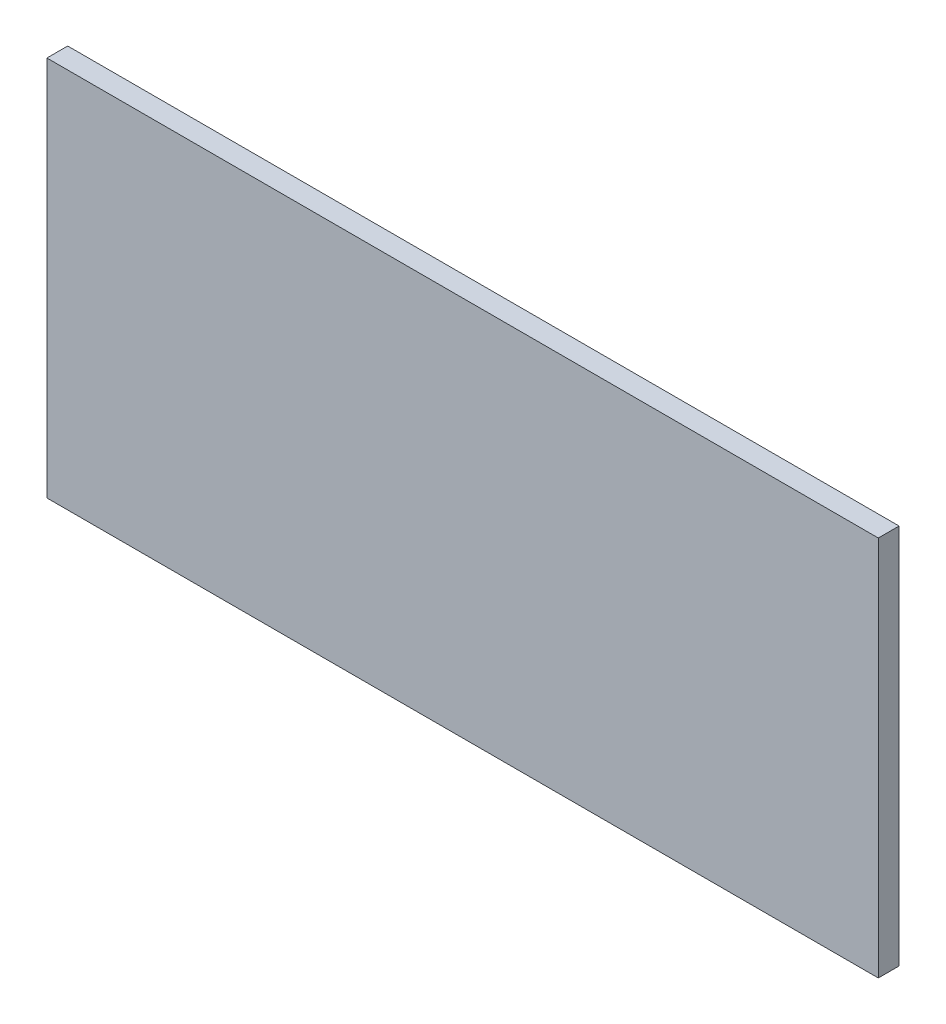
ISO-10303-21;
HEADER;
FILE_DESCRIPTION(('STEP AP214'),'2;1');
FILE_NAME('part.step','',(''),(''),'','','');
FILE_SCHEMA(('AUTOMOTIVE_DESIGN { 1 0 10303 214 1 1 1 1 }'));
ENDSEC;
DATA;
#1=APPLICATION_CONTEXT('core data for automotive mechanical design processes');
#2=APPLICATION_PROTOCOL_DEFINITION('international standard','automotive_design',2000,#1);
#3=PRODUCT_CONTEXT('',#1,'mechanical');
#4=PRODUCT('Part','Part','',(#3));
#5=PRODUCT_RELATED_PRODUCT_CATEGORY('part','',(#4));
#6=PRODUCT_DEFINITION_FORMATION('','',#4);
#7=PRODUCT_DEFINITION_CONTEXT('part definition',#1,'design');
#8=PRODUCT_DEFINITION('design','',#6,#7);
#9=PRODUCT_DEFINITION_SHAPE('','',#8);
#10=(LENGTH_UNIT() NAMED_UNIT(*) SI_UNIT(.MILLI.,.METRE.));
#11=(NAMED_UNIT(*) PLANE_ANGLE_UNIT() SI_UNIT($,.RADIAN.));
#12=(NAMED_UNIT(*) SI_UNIT($,.STERADIAN.) SOLID_ANGLE_UNIT());
#13=UNCERTAINTY_MEASURE_WITH_UNIT(LENGTH_MEASURE(1.E-05),#10,'distance_accuracy_value','');
#14=(GEOMETRIC_REPRESENTATION_CONTEXT(3) GLOBAL_UNCERTAINTY_ASSIGNED_CONTEXT((#13)) GLOBAL_UNIT_ASSIGNED_CONTEXT((#10,
#11,#12)) REPRESENTATION_CONTEXT('',''));
#15=CARTESIAN_POINT('',(0.,0.,0.));
#16=DIRECTION('',(0.,0.,1.));
#17=DIRECTION('',(1.,0.,0.));
#18=AXIS2_PLACEMENT_3D('',#15,#16,#17);
#19=CARTESIAN_POINT('',(0.,0.,-3.));
#20=DIRECTION('',(-1.,0.,0.));
#21=DIRECTION('',(0.,0.,1.));
#22=AXIS2_PLACEMENT_3D('',#19,#20,#21);
#23=PLANE('',#22);
#24=DIRECTION('',(0.,-1.,0.));
#25=VECTOR('',#24,1.);
#26=CARTESIAN_POINT('',(0.,0.,0.));
#27=LINE('',#26,#25);
#28=CARTESIAN_POINT('',(0.,55.,0.));
#29=VERTEX_POINT('',#28);
#30=CARTESIAN_POINT('',(0.,0.,0.));
#31=VERTEX_POINT('',#30);
#32=EDGE_CURVE('E97',#29,#31,#27,.T.);
#33=ORIENTED_EDGE('',*,*,#32,.F.);
#34=DIRECTION('',(0.,0.,1.));
#35=VECTOR('',#34,1.);
#36=CARTESIAN_POINT('',(0.,55.,-3.));
#37=LINE('',#36,#35);
#38=CARTESIAN_POINT('',(0.,55.,-3.));
#39=VERTEX_POINT('',#38);
#40=EDGE_CURVE('E11',#39,#29,#37,.T.);
#41=ORIENTED_EDGE('',*,*,#40,.F.);
#42=DIRECTION('',(0.,-1.,0.));
#43=VECTOR('',#42,1.);
#44=CARTESIAN_POINT('',(0.,0.,-3.));
#45=LINE('',#44,#43);
#46=CARTESIAN_POINT('',(0.,0.,-3.));
#47=VERTEX_POINT('',#46);
#48=EDGE_CURVE('E91',#39,#47,#45,.T.);
#49=ORIENTED_EDGE('',*,*,#48,.T.);
#50=DIRECTION('',(0.,0.,1.));
#51=VECTOR('',#50,1.);
#52=CARTESIAN_POINT('',(0.,0.,-3.));
#53=LINE('',#52,#51);
#54=EDGE_CURVE('E36',#47,#31,#53,.T.);
#55=ORIENTED_EDGE('',*,*,#54,.T.);
#56=EDGE_LOOP('',(#33,#41,#49,#55));
#57=FACE_BOUND('',#56,.T.);
#58=ADVANCED_FACE('F33',(#57),#23,.T.);
#59=CARTESIAN_POINT('',(0.,55.,-3.));
#60=DIRECTION('',(0.,1.,0.));
#61=DIRECTION('',(0.,0.,1.));
#62=AXIS2_PLACEMENT_3D('',#59,#60,#61);
#63=PLANE('',#62);
#64=DIRECTION('',(-1.,0.,0.));
#65=VECTOR('',#64,1.);
#66=CARTESIAN_POINT('',(0.,55.,0.));
#67=LINE('',#66,#65);
#68=CARTESIAN_POINT('',(120.,55.,0.));
#69=VERTEX_POINT('',#68);
#70=EDGE_CURVE('E93',#69,#29,#67,.T.);
#71=ORIENTED_EDGE('',*,*,#70,.F.);
#72=DIRECTION('',(0.,0.,1.));
#73=VECTOR('',#72,1.);
#74=CARTESIAN_POINT('',(120.,55.,-3.));
#75=LINE('',#74,#73);
#76=CARTESIAN_POINT('',(120.,55.,-3.));
#77=VERTEX_POINT('',#76);
#78=EDGE_CURVE('E42',#77,#69,#75,.T.);
#79=ORIENTED_EDGE('',*,*,#78,.F.);
#80=DIRECTION('',(-1.,0.,0.));
#81=VECTOR('',#80,1.);
#82=CARTESIAN_POINT('',(0.,55.,-3.));
#83=LINE('',#82,#81);
#84=EDGE_CURVE('E88',#77,#39,#83,.T.);
#85=ORIENTED_EDGE('',*,*,#84,.T.);
#86=ORIENTED_EDGE('',*,*,#40,.T.);
#87=EDGE_LOOP('',(#71,#79,#85,#86));
#88=FACE_BOUND('',#87,.T.);
#89=ADVANCED_FACE('F107',(#88),#63,.T.);
#90=CARTESIAN_POINT('',(120.,0.,-3.));
#91=DIRECTION('',(1.,0.,0.));
#92=DIRECTION('',(0.,0.,-1.));
#93=AXIS2_PLACEMENT_3D('',#90,#91,#92);
#94=PLANE('',#93);
#95=DIRECTION('',(0.,1.,0.));
#96=VECTOR('',#95,1.);
#97=CARTESIAN_POINT('',(120.,0.,0.));
#98=LINE('',#97,#96);
#99=CARTESIAN_POINT('',(120.,0.,0.));
#100=VERTEX_POINT('',#99);
#101=EDGE_CURVE('E83',#100,#69,#98,.T.);
#102=ORIENTED_EDGE('',*,*,#101,.F.);
#103=DIRECTION('',(0.,0.,1.));
#104=VECTOR('',#103,1.);
#105=CARTESIAN_POINT('',(120.,0.,-3.));
#106=LINE('',#105,#104);
#107=CARTESIAN_POINT('',(120.,0.,-3.));
#108=VERTEX_POINT('',#107);
#109=EDGE_CURVE('E78',#108,#100,#106,.T.);
#110=ORIENTED_EDGE('',*,*,#109,.F.);
#111=DIRECTION('',(0.,1.,0.));
#112=VECTOR('',#111,1.);
#113=CARTESIAN_POINT('',(120.,0.,-3.));
#114=LINE('',#113,#112);
#115=EDGE_CURVE('E81',#108,#77,#114,.T.);
#116=ORIENTED_EDGE('',*,*,#115,.T.);
#117=ORIENTED_EDGE('',*,*,#78,.T.);
#118=EDGE_LOOP('',(#102,#110,#116,#117));
#119=FACE_BOUND('',#118,.T.);
#120=ADVANCED_FACE('F80',(#119),#94,.T.);
#121=CARTESIAN_POINT('',(0.,0.,-3.));
#122=DIRECTION('',(0.,-1.,0.));
#123=DIRECTION('',(0.,0.,-1.));
#124=AXIS2_PLACEMENT_3D('',#121,#122,#123);
#125=PLANE('',#124);
#126=DIRECTION('',(1.,0.,0.));
#127=VECTOR('',#126,1.);
#128=CARTESIAN_POINT('',(0.,0.,0.));
#129=LINE('',#128,#127);
#130=EDGE_CURVE('E100',#31,#100,#129,.T.);
#131=ORIENTED_EDGE('',*,*,#130,.F.);
#132=ORIENTED_EDGE('',*,*,#54,.F.);
#133=DIRECTION('',(1.,0.,0.));
#134=VECTOR('',#133,1.);
#135=CARTESIAN_POINT('',(0.,0.,-3.));
#136=LINE('',#135,#134);
#137=EDGE_CURVE('E87',#47,#108,#136,.T.);
#138=ORIENTED_EDGE('',*,*,#137,.T.);
#139=ORIENTED_EDGE('',*,*,#109,.T.);
#140=EDGE_LOOP('',(#131,#132,#138,#139));
#141=FACE_BOUND('',#140,.T.);
#142=ADVANCED_FACE('F90',(#141),#125,.T.);
#143=CARTESIAN_POINT('',(0.,0.,-3.));
#144=DIRECTION('',(0.,0.,-1.));
#145=DIRECTION('',(-1.,0.,0.));
#146=AXIS2_PLACEMENT_3D('',#143,#144,#145);
#147=PLANE('',#146);
#148=ORIENTED_EDGE('',*,*,#48,.F.);
#149=ORIENTED_EDGE('',*,*,#84,.F.);
#150=ORIENTED_EDGE('',*,*,#115,.F.);
#151=ORIENTED_EDGE('',*,*,#137,.F.);
#152=EDGE_LOOP('',(#148,#149,#150,#151));
#153=FACE_BOUND('',#152,.T.);
#154=ADVANCED_FACE('F86',(#153),#147,.T.);
#155=CARTESIAN_POINT('',(0.,0.,0.));
#156=DIRECTION('',(0.,0.,-1.));
#157=DIRECTION('',(-1.,0.,0.));
#158=AXIS2_PLACEMENT_3D('',#155,#156,#157);
#159=PLANE('',#158);
#160=ORIENTED_EDGE('',*,*,#32,.T.);
#161=ORIENTED_EDGE('',*,*,#130,.T.);
#162=ORIENTED_EDGE('',*,*,#101,.T.);
#163=ORIENTED_EDGE('',*,*,#70,.T.);
#164=EDGE_LOOP('',(#160,#161,#162,#163));
#165=FACE_BOUND('',#164,.T.);
#166=ADVANCED_FACE('F106',(#165),#159,.F.);
#167=CLOSED_SHELL('',(#58,#89,#120,#142,#154,#166));
#168=MANIFOLD_SOLID_BREP('B2',#167);
#169=ADVANCED_BREP_SHAPE_REPRESENTATION('',(#18,#168),#14);
#170=SHAPE_DEFINITION_REPRESENTATION(#9,#169);
ENDSEC;
END-ISO-10303-21;
